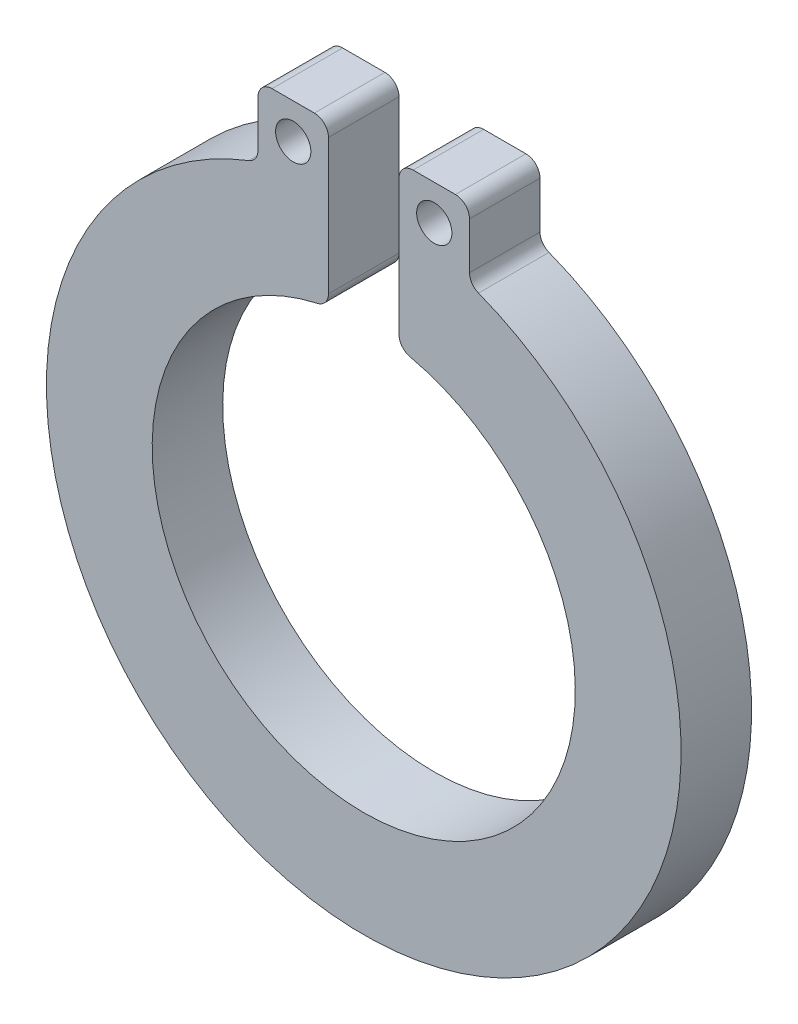
ISO-10303-21;
HEADER;
FILE_DESCRIPTION(('STEP AP214'),'2;1');
FILE_NAME('part.step','',(''),(''),'','','');
FILE_SCHEMA(('AUTOMOTIVE_DESIGN { 1 0 10303 214 1 1 1 1 }'));
ENDSEC;
DATA;
#1=APPLICATION_CONTEXT('core data for automotive mechanical design processes');
#2=APPLICATION_PROTOCOL_DEFINITION('international standard','automotive_design',2000,#1);
#3=PRODUCT_CONTEXT('',#1,'mechanical');
#4=PRODUCT('Part','Part','',(#3));
#5=PRODUCT_RELATED_PRODUCT_CATEGORY('part','',(#4));
#6=PRODUCT_DEFINITION_FORMATION('','',#4);
#7=PRODUCT_DEFINITION_CONTEXT('part definition',#1,'design');
#8=PRODUCT_DEFINITION('design','',#6,#7);
#9=PRODUCT_DEFINITION_SHAPE('','',#8);
#10=(LENGTH_UNIT() NAMED_UNIT(*) SI_UNIT(.MILLI.,.METRE.));
#11=(NAMED_UNIT(*) PLANE_ANGLE_UNIT() SI_UNIT($,.RADIAN.));
#12=(NAMED_UNIT(*) SI_UNIT($,.STERADIAN.) SOLID_ANGLE_UNIT());
#13=UNCERTAINTY_MEASURE_WITH_UNIT(LENGTH_MEASURE(1.E-05),#10,'distance_accuracy_value','');
#14=(GEOMETRIC_REPRESENTATION_CONTEXT(3) GLOBAL_UNCERTAINTY_ASSIGNED_CONTEXT((#13)) GLOBAL_UNIT_ASSIGNED_CONTEXT((#10,
#11,#12)) REPRESENTATION_CONTEXT('',''));
#15=CARTESIAN_POINT('',(0.,0.,0.));
#16=DIRECTION('',(0.,0.,1.));
#17=DIRECTION('',(1.,0.,0.));
#18=AXIS2_PLACEMENT_3D('',#15,#16,#17);
#19=CARTESIAN_POINT('',(0.,0.,0.5));
#20=DIRECTION('',(0.,0.,1.));
#21=DIRECTION('',(1.,0.,0.));
#22=AXIS2_PLACEMENT_3D('',#19,#20,#21);
#23=PLANE('',#22);
#24=CARTESIAN_POINT('',(-0.5,2.37132034355964,0.5));
#25=DIRECTION('',(0.,0.,1.));
#26=DIRECTION('',(1.,0.,0.));
#27=AXIS2_PLACEMENT_3D('',#24,#25,#26);
#28=CIRCLE('',#27,0.125);
#29=CARTESIAN_POINT('',(-0.375,2.37132034355964,0.5));
#30=VERTEX_POINT('',#29);
#31=EDGE_CURVE('E186',#30,#30,#28,.T.);
#32=ORIENTED_EDGE('',*,*,#31,.F.);
#33=EDGE_LOOP('',(#32));
#34=FACE_BOUND('',#33,.T.);
#35=DIRECTION('',(-1.,0.,0.));
#36=VECTOR('',#35,1.);
#37=CARTESIAN_POINT('',(-0.25,2.62132034355964,0.5));
#38=LINE('',#37,#36);
#39=CARTESIAN_POINT('',(-0.35,2.62132034355964,0.5));
#40=VERTEX_POINT('',#39);
#41=CARTESIAN_POINT('',(-0.65,2.62132034355964,0.5));
#42=VERTEX_POINT('',#41);
#43=EDGE_CURVE('E203',#40,#42,#38,.T.);
#44=ORIENTED_EDGE('',*,*,#43,.T.);
#45=CARTESIAN_POINT('',(-0.65,2.52132034355964,0.5));
#46=DIRECTION('',(0.,0.,1.));
#47=DIRECTION('',(1.,0.,0.));
#48=AXIS2_PLACEMENT_3D('',#45,#46,#47);
#49=CIRCLE('',#48,0.1);
#50=CARTESIAN_POINT('',(-0.75,2.52132034355964,0.5));
#51=VERTEX_POINT('',#50);
#52=EDGE_CURVE('E226',#42,#51,#49,.T.);
#53=ORIENTED_EDGE('',*,*,#52,.T.);
#54=DIRECTION('',(0.,-1.,0.));
#55=VECTOR('',#54,1.);
#56=CARTESIAN_POINT('',(-0.75,2.62132034355964,0.5));
#57=LINE('',#56,#55);
#58=CARTESIAN_POINT('',(-0.75,2.19089023002066,0.5));
#59=VERTEX_POINT('',#58);
#60=EDGE_CURVE('E173',#51,#59,#57,.T.);
#61=ORIENTED_EDGE('',*,*,#60,.T.);
#62=CARTESIAN_POINT('',(-0.85,2.19089023002066,0.5));
#63=DIRECTION('',(0.,0.,1.));
#64=DIRECTION('',(1.,0.,0.));
#65=AXIS2_PLACEMENT_3D('',#62,#63,#64);
#66=CIRCLE('',#65,0.1);
#67=CARTESIAN_POINT('',(-0.813829787234043,2.09766085853042,0.5));
#68=VERTEX_POINT('',#67);
#69=EDGE_CURVE('E11',#59,#68,#66,.F.);
#70=ORIENTED_EDGE('',*,*,#69,.T.);
#71=CARTESIAN_POINT('',(0.,0.,0.5));
#72=DIRECTION('',(0.,0.,1.));
#73=DIRECTION('',(1.,0.,0.));
#74=AXIS2_PLACEMENT_3D('',#71,#72,#73);
#75=CIRCLE('',#74,2.25);
#76=CARTESIAN_POINT('',(0.813829787234043,2.09766085853042,0.5));
#77=VERTEX_POINT('',#76);
#78=EDGE_CURVE('E269',#68,#77,#75,.T.);
#79=ORIENTED_EDGE('',*,*,#78,.T.);
#80=CARTESIAN_POINT('',(0.85,2.19089023002066,0.5));
#81=DIRECTION('',(0.,0.,1.));
#82=DIRECTION('',(1.,0.,0.));
#83=AXIS2_PLACEMENT_3D('',#80,#81,#82);
#84=CIRCLE('',#83,0.1);
#85=CARTESIAN_POINT('',(0.75,2.19089023002066,0.5));
#86=VERTEX_POINT('',#85);
#87=EDGE_CURVE('E259',#77,#86,#84,.F.);
#88=ORIENTED_EDGE('',*,*,#87,.T.);
#89=DIRECTION('',(0.,1.,0.));
#90=VECTOR('',#89,1.);
#91=CARTESIAN_POINT('',(0.75,2.62132034355964,0.5));
#92=LINE('',#91,#90);
#93=CARTESIAN_POINT('',(0.75,2.52132034355964,0.5));
#94=VERTEX_POINT('',#93);
#95=EDGE_CURVE('E266',#86,#94,#92,.T.);
#96=ORIENTED_EDGE('',*,*,#95,.T.);
#97=CARTESIAN_POINT('',(0.65,2.52132034355964,0.5));
#98=DIRECTION('',(0.,0.,1.));
#99=DIRECTION('',(1.,0.,0.));
#100=AXIS2_PLACEMENT_3D('',#97,#98,#99);
#101=CIRCLE('',#100,0.1);
#102=CARTESIAN_POINT('',(0.65,2.62132034355964,0.5));
#103=VERTEX_POINT('',#102);
#104=EDGE_CURVE('E220',#94,#103,#101,.T.);
#105=ORIENTED_EDGE('',*,*,#104,.T.);
#106=DIRECTION('',(-1.,0.,0.));
#107=VECTOR('',#106,1.);
#108=CARTESIAN_POINT('',(0.25,2.62132034355964,0.5));
#109=LINE('',#108,#107);
#110=CARTESIAN_POINT('',(0.35,2.62132034355964,0.5));
#111=VERTEX_POINT('',#110);
#112=EDGE_CURVE('E277',#103,#111,#109,.T.);
#113=ORIENTED_EDGE('',*,*,#112,.T.);
#114=CARTESIAN_POINT('',(0.35,2.52132034355964,0.5));
#115=DIRECTION('',(0.,0.,1.));
#116=DIRECTION('',(1.,0.,0.));
#117=AXIS2_PLACEMENT_3D('',#114,#115,#116);
#118=CIRCLE('',#117,0.1);
#119=CARTESIAN_POINT('',(0.25,2.52132034355964,0.5));
#120=VERTEX_POINT('',#119);
#121=EDGE_CURVE('E222',#111,#120,#118,.T.);
#122=ORIENTED_EDGE('',*,*,#121,.T.);
#123=DIRECTION('',(0.,-1.,0.));
#124=VECTOR('',#123,1.);
#125=CARTESIAN_POINT('',(0.25,2.62132034355964,0.5));
#126=LINE('',#125,#124);
#127=CARTESIAN_POINT('',(0.25,1.5612494995996,0.5));
#128=VERTEX_POINT('',#127);
#129=EDGE_CURVE('E293',#120,#128,#126,.T.);
#130=ORIENTED_EDGE('',*,*,#129,.T.);
#131=CARTESIAN_POINT('',(0.35,1.5612494995996,0.5));
#132=DIRECTION('',(0.,0.,1.));
#133=DIRECTION('',(1.,0.,0.));
#134=AXIS2_PLACEMENT_3D('',#131,#132,#133);
#135=CIRCLE('',#134,0.1);
#136=CARTESIAN_POINT('',(0.328125,1.46367140587462,0.5));
#137=VERTEX_POINT('',#136);
#138=EDGE_CURVE('E218',#128,#137,#135,.T.);
#139=ORIENTED_EDGE('',*,*,#138,.T.);
#140=CARTESIAN_POINT('',(0.,0.,0.5));
#141=DIRECTION('',(0.,0.,-1.));
#142=DIRECTION('',(1.,0.,0.));
#143=AXIS2_PLACEMENT_3D('',#140,#141,#142);
#144=CIRCLE('',#143,1.5);
#145=CARTESIAN_POINT('',(-0.328125,1.46367140587462,0.5));
#146=VERTEX_POINT('',#145);
#147=EDGE_CURVE('E296',#137,#146,#144,.T.);
#148=ORIENTED_EDGE('',*,*,#147,.T.);
#149=CARTESIAN_POINT('',(-0.35,1.5612494995996,0.5));
#150=DIRECTION('',(0.,0.,1.));
#151=DIRECTION('',(1.,0.,0.));
#152=AXIS2_PLACEMENT_3D('',#149,#150,#151);
#153=CIRCLE('',#152,0.1);
#154=CARTESIAN_POINT('',(-0.25,1.5612494995996,0.5));
#155=VERTEX_POINT('',#154);
#156=EDGE_CURVE('E61',#146,#155,#153,.T.);
#157=ORIENTED_EDGE('',*,*,#156,.T.);
#158=DIRECTION('',(0.,1.,0.));
#159=VECTOR('',#158,1.);
#160=CARTESIAN_POINT('',(-0.25,2.62132034355964,0.5));
#161=LINE('',#160,#159);
#162=CARTESIAN_POINT('',(-0.25,2.52132034355964,0.5));
#163=VERTEX_POINT('',#162);
#164=EDGE_CURVE('E204',#155,#163,#161,.T.);
#165=ORIENTED_EDGE('',*,*,#164,.T.);
#166=CARTESIAN_POINT('',(-0.35,2.52132034355964,0.5));
#167=DIRECTION('',(0.,0.,1.));
#168=DIRECTION('',(1.,0.,0.));
#169=AXIS2_PLACEMENT_3D('',#166,#167,#168);
#170=CIRCLE('',#169,0.1);
#171=EDGE_CURVE('E224',#163,#40,#170,.T.);
#172=ORIENTED_EDGE('',*,*,#171,.T.);
#173=EDGE_LOOP('',(#44,#53,#61,#70,#79,#88,#96,#105,#113,#122,#130,#139,#148,#157,#165,#172));
#174=FACE_BOUND('',#173,.T.);
#175=CARTESIAN_POINT('',(0.5,2.37132034355964,0.5));
#176=DIRECTION('',(0.,0.,1.));
#177=DIRECTION('',(1.,0.,0.));
#178=AXIS2_PLACEMENT_3D('',#175,#176,#177);
#179=CIRCLE('',#178,0.125);
#180=CARTESIAN_POINT('',(0.625,2.37132034355964,0.5));
#181=VERTEX_POINT('',#180);
#182=EDGE_CURVE('E503',#181,#181,#179,.T.);
#183=ORIENTED_EDGE('',*,*,#182,.F.);
#184=EDGE_LOOP('',(#183));
#185=FACE_BOUND('',#184,.T.);
#186=ADVANCED_FACE('F39',(#34,#174,#185),#23,.T.);
#187=CARTESIAN_POINT('',(0.,0.,0.));
#188=DIRECTION('',(0.,0.,1.));
#189=DIRECTION('',(1.,0.,0.));
#190=AXIS2_PLACEMENT_3D('',#187,#188,#189);
#191=PLANE('',#190);
#192=DIRECTION('',(0.,-1.,0.));
#193=VECTOR('',#192,1.);
#194=CARTESIAN_POINT('',(-0.75,2.62132034355964,0.));
#195=LINE('',#194,#193);
#196=CARTESIAN_POINT('',(-0.75,2.52132034355964,0.));
#197=VERTEX_POINT('',#196);
#198=CARTESIAN_POINT('',(-0.75,2.19089023002066,0.));
#199=VERTEX_POINT('',#198);
#200=EDGE_CURVE('E170',#197,#199,#195,.T.);
#201=ORIENTED_EDGE('',*,*,#200,.F.);
#202=CARTESIAN_POINT('',(-0.65,2.52132034355964,0.));
#203=DIRECTION('',(0.,0.,1.));
#204=DIRECTION('',(1.,0.,0.));
#205=AXIS2_PLACEMENT_3D('',#202,#203,#204);
#206=CIRCLE('',#205,0.1);
#207=CARTESIAN_POINT('',(-0.65,2.62132034355964,0.));
#208=VERTEX_POINT('',#207);
#209=EDGE_CURVE('E153',#197,#208,#206,.F.);
#210=ORIENTED_EDGE('',*,*,#209,.T.);
#211=DIRECTION('',(-1.,0.,0.));
#212=VECTOR('',#211,1.);
#213=CARTESIAN_POINT('',(-0.25,2.62132034355964,0.));
#214=LINE('',#213,#212);
#215=CARTESIAN_POINT('',(-0.35,2.62132034355964,0.));
#216=VERTEX_POINT('',#215);
#217=EDGE_CURVE('E181',#216,#208,#214,.T.);
#218=ORIENTED_EDGE('',*,*,#217,.F.);
#219=CARTESIAN_POINT('',(-0.35,2.52132034355964,0.));
#220=DIRECTION('',(0.,0.,1.));
#221=DIRECTION('',(1.,0.,0.));
#222=AXIS2_PLACEMENT_3D('',#219,#220,#221);
#223=CIRCLE('',#222,0.1);
#224=CARTESIAN_POINT('',(-0.25,2.52132034355964,0.));
#225=VERTEX_POINT('',#224);
#226=EDGE_CURVE('E164',#216,#225,#223,.F.);
#227=ORIENTED_EDGE('',*,*,#226,.T.);
#228=DIRECTION('',(0.,1.,0.));
#229=VECTOR('',#228,1.);
#230=CARTESIAN_POINT('',(-0.25,2.62132034355964,0.));
#231=LINE('',#230,#229);
#232=CARTESIAN_POINT('',(-0.25,1.5612494995996,0.));
#233=VERTEX_POINT('',#232);
#234=EDGE_CURVE('E201',#233,#225,#231,.T.);
#235=ORIENTED_EDGE('',*,*,#234,.F.);
#236=CARTESIAN_POINT('',(-0.35,1.5612494995996,0.));
#237=DIRECTION('',(0.,0.,1.));
#238=DIRECTION('',(1.,0.,0.));
#239=AXIS2_PLACEMENT_3D('',#236,#237,#238);
#240=CIRCLE('',#239,0.1);
#241=CARTESIAN_POINT('',(-0.328125,1.46367140587462,0.));
#242=VERTEX_POINT('',#241);
#243=EDGE_CURVE('E174',#233,#242,#240,.F.);
#244=ORIENTED_EDGE('',*,*,#243,.T.);
#245=CARTESIAN_POINT('',(0.,0.,0.));
#246=DIRECTION('',(0.,0.,-1.));
#247=DIRECTION('',(1.,0.,0.));
#248=AXIS2_PLACEMENT_3D('',#245,#246,#247);
#249=CIRCLE('',#248,1.5);
#250=CARTESIAN_POINT('',(0.328125,1.46367140587462,0.));
#251=VERTEX_POINT('',#250);
#252=EDGE_CURVE('E198',#251,#242,#249,.T.);
#253=ORIENTED_EDGE('',*,*,#252,.F.);
#254=CARTESIAN_POINT('',(0.35,1.5612494995996,0.));
#255=DIRECTION('',(0.,0.,1.));
#256=DIRECTION('',(1.,0.,0.));
#257=AXIS2_PLACEMENT_3D('',#254,#255,#256);
#258=CIRCLE('',#257,0.1);
#259=CARTESIAN_POINT('',(0.25,1.5612494995996,0.));
#260=VERTEX_POINT('',#259);
#261=EDGE_CURVE('E207',#251,#260,#258,.F.);
#262=ORIENTED_EDGE('',*,*,#261,.T.);
#263=DIRECTION('',(0.,-1.,0.));
#264=VECTOR('',#263,1.);
#265=CARTESIAN_POINT('',(0.25,2.62132034355964,0.));
#266=LINE('',#265,#264);
#267=CARTESIAN_POINT('',(0.25,2.52132034355964,0.));
#268=VERTEX_POINT('',#267);
#269=EDGE_CURVE('E195',#268,#260,#266,.T.);
#270=ORIENTED_EDGE('',*,*,#269,.F.);
#271=CARTESIAN_POINT('',(0.35,2.52132034355964,0.));
#272=DIRECTION('',(0.,0.,1.));
#273=DIRECTION('',(1.,0.,0.));
#274=AXIS2_PLACEMENT_3D('',#271,#272,#273);
#275=CIRCLE('',#274,0.1);
#276=CARTESIAN_POINT('',(0.35,2.62132034355964,0.));
#277=VERTEX_POINT('',#276);
#278=EDGE_CURVE('E211',#268,#277,#275,.F.);
#279=ORIENTED_EDGE('',*,*,#278,.T.);
#280=DIRECTION('',(-1.,0.,0.));
#281=VECTOR('',#280,1.);
#282=CARTESIAN_POINT('',(0.25,2.62132034355964,0.));
#283=LINE('',#282,#281);
#284=CARTESIAN_POINT('',(0.65,2.62132034355964,0.));
#285=VERTEX_POINT('',#284);
#286=EDGE_CURVE('E192',#285,#277,#283,.T.);
#287=ORIENTED_EDGE('',*,*,#286,.F.);
#288=CARTESIAN_POINT('',(0.65,2.52132034355964,0.));
#289=DIRECTION('',(0.,0.,1.));
#290=DIRECTION('',(1.,0.,0.));
#291=AXIS2_PLACEMENT_3D('',#288,#289,#290);
#292=CIRCLE('',#291,0.1);
#293=CARTESIAN_POINT('',(0.75,2.52132034355964,0.));
#294=VERTEX_POINT('',#293);
#295=EDGE_CURVE('E209',#285,#294,#292,.F.);
#296=ORIENTED_EDGE('',*,*,#295,.T.);
#297=DIRECTION('',(0.,1.,0.));
#298=VECTOR('',#297,1.);
#299=CARTESIAN_POINT('',(0.75,2.62132034355964,0.));
#300=LINE('',#299,#298);
#301=CARTESIAN_POINT('',(0.75,2.19089023002066,0.));
#302=VERTEX_POINT('',#301);
#303=EDGE_CURVE('E184',#302,#294,#300,.T.);
#304=ORIENTED_EDGE('',*,*,#303,.F.);
#305=CARTESIAN_POINT('',(0.85,2.19089023002066,0.));
#306=DIRECTION('',(0.,0.,1.));
#307=DIRECTION('',(1.,0.,0.));
#308=AXIS2_PLACEMENT_3D('',#305,#306,#307);
#309=CIRCLE('',#308,0.1);
#310=CARTESIAN_POINT('',(0.813829787234043,2.09766085853042,0.));
#311=VERTEX_POINT('',#310);
#312=EDGE_CURVE('E257',#302,#311,#309,.T.);
#313=ORIENTED_EDGE('',*,*,#312,.T.);
#314=CARTESIAN_POINT('',(0.,0.,0.));
#315=DIRECTION('',(0.,0.,1.));
#316=DIRECTION('',(1.,0.,0.));
#317=AXIS2_PLACEMENT_3D('',#314,#315,#316);
#318=CIRCLE('',#317,2.25);
#319=CARTESIAN_POINT('',(-0.813829787234043,2.09766085853042,0.));
#320=VERTEX_POINT('',#319);
#321=EDGE_CURVE('E180',#320,#311,#318,.T.);
#322=ORIENTED_EDGE('',*,*,#321,.F.);
#323=CARTESIAN_POINT('',(-0.85,2.19089023002066,0.));
#324=DIRECTION('',(0.,0.,1.));
#325=DIRECTION('',(1.,0.,0.));
#326=AXIS2_PLACEMENT_3D('',#323,#324,#325);
#327=CIRCLE('',#326,0.1);
#328=EDGE_CURVE('E47',#320,#199,#327,.T.);
#329=ORIENTED_EDGE('',*,*,#328,.T.);
#330=EDGE_LOOP('',(#201,#210,#218,#227,#235,#244,#253,#262,#270,#279,#287,#296,#304,#313,#322,#329));
#331=FACE_BOUND('',#330,.T.);
#332=CARTESIAN_POINT('',(-0.5,2.37132034355964,0.));
#333=DIRECTION('',(0.,0.,1.));
#334=DIRECTION('',(1.,0.,0.));
#335=AXIS2_PLACEMENT_3D('',#332,#333,#334);
#336=CIRCLE('',#335,0.125);
#337=CARTESIAN_POINT('',(-0.375,2.37132034355964,0.));
#338=VERTEX_POINT('',#337);
#339=EDGE_CURVE('E502',#338,#338,#336,.T.);
#340=ORIENTED_EDGE('',*,*,#339,.T.);
#341=EDGE_LOOP('',(#340));
#342=FACE_BOUND('',#341,.T.);
#343=CARTESIAN_POINT('',(0.5,2.37132034355964,0.));
#344=DIRECTION('',(0.,0.,1.));
#345=DIRECTION('',(1.,0.,0.));
#346=AXIS2_PLACEMENT_3D('',#343,#344,#345);
#347=CIRCLE('',#346,0.125);
#348=CARTESIAN_POINT('',(0.625,2.37132034355964,0.));
#349=VERTEX_POINT('',#348);
#350=EDGE_CURVE('E506',#349,#349,#347,.T.);
#351=ORIENTED_EDGE('',*,*,#350,.T.);
#352=EDGE_LOOP('',(#351));
#353=FACE_BOUND('',#352,.T.);
#354=ADVANCED_FACE('F177',(#331,#342,#353),#191,.F.);
#355=CARTESIAN_POINT('',(-0.25,2.62132034355964,0.5));
#356=DIRECTION('',(0.,-1.,0.));
#357=DIRECTION('',(0.,0.,-1.));
#358=AXIS2_PLACEMENT_3D('',#355,#356,#357);
#359=PLANE('',#358);
#360=ORIENTED_EDGE('',*,*,#217,.T.);
#361=DIRECTION('',(0.,0.,-1.));
#362=VECTOR('',#361,1.);
#363=CARTESIAN_POINT('',(-0.65,2.62132034355964,0.5));
#364=LINE('',#363,#362);
#365=EDGE_CURVE('E158',#208,#42,#364,.F.);
#366=ORIENTED_EDGE('',*,*,#365,.T.);
#367=ORIENTED_EDGE('',*,*,#43,.F.);
#368=DIRECTION('',(0.,0.,-1.));
#369=VECTOR('',#368,1.);
#370=CARTESIAN_POINT('',(-0.35,2.62132034355964,0.5));
#371=LINE('',#370,#369);
#372=EDGE_CURVE('E163',#40,#216,#371,.T.);
#373=ORIENTED_EDGE('',*,*,#372,.T.);
#374=EDGE_LOOP('',(#360,#366,#367,#373));
#375=FACE_BOUND('',#374,.T.);
#376=ADVANCED_FACE('F304',(#375),#359,.F.);
#377=CARTESIAN_POINT('',(-0.75,2.62132034355964,0.5));
#378=DIRECTION('',(1.,0.,0.));
#379=DIRECTION('',(0.,1.,0.));
#380=AXIS2_PLACEMENT_3D('',#377,#378,#379);
#381=PLANE('',#380);
#382=ORIENTED_EDGE('',*,*,#60,.F.);
#383=DIRECTION('',(0.,0.,-1.));
#384=VECTOR('',#383,1.);
#385=CARTESIAN_POINT('',(-0.75,2.52132034355964,0.5));
#386=LINE('',#385,#384);
#387=EDGE_CURVE('E157',#51,#197,#386,.T.);
#388=ORIENTED_EDGE('',*,*,#387,.T.);
#389=ORIENTED_EDGE('',*,*,#200,.T.);
#390=DIRECTION('',(0.,0.,1.));
#391=VECTOR('',#390,1.);
#392=CARTESIAN_POINT('',(-0.75,2.19089023002066,0.5));
#393=LINE('',#392,#391);
#394=EDGE_CURVE('E175',#199,#59,#393,.T.);
#395=ORIENTED_EDGE('',*,*,#394,.T.);
#396=EDGE_LOOP('',(#382,#388,#389,#395));
#397=FACE_BOUND('',#396,.T.);
#398=ADVANCED_FACE('F169',(#397),#381,.F.);
#399=CARTESIAN_POINT('',(0.,0.,0.5));
#400=DIRECTION('',(0.,0.,-1.));
#401=DIRECTION('',(-1.,0.,0.));
#402=AXIS2_PLACEMENT_3D('',#399,#400,#401);
#403=CYLINDRICAL_SURFACE('',#402,2.25);
#404=ORIENTED_EDGE('',*,*,#321,.T.);
#405=DIRECTION('',(0.,0.,-1.));
#406=VECTOR('',#405,1.);
#407=CARTESIAN_POINT('',(0.813829787234043,2.09766085853042,0.5));
#408=LINE('',#407,#406);
#409=EDGE_CURVE('E250',#311,#77,#408,.F.);
#410=ORIENTED_EDGE('',*,*,#409,.T.);
#411=ORIENTED_EDGE('',*,*,#78,.F.);
#412=DIRECTION('',(0.,0.,-1.));
#413=VECTOR('',#412,1.);
#414=CARTESIAN_POINT('',(-0.813829787234043,2.09766085853042,0.5));
#415=LINE('',#414,#413);
#416=EDGE_CURVE('E247',#68,#320,#415,.T.);
#417=ORIENTED_EDGE('',*,*,#416,.T.);
#418=EDGE_LOOP('',(#404,#410,#411,#417));
#419=FACE_BOUND('',#418,.T.);
#420=ADVANCED_FACE('F281',(#419),#403,.T.);
#421=CARTESIAN_POINT('',(0.75,2.62132034355964,0.5));
#422=DIRECTION('',(-1.,0.,0.));
#423=DIRECTION('',(0.,-1.,0.));
#424=AXIS2_PLACEMENT_3D('',#421,#422,#423);
#425=PLANE('',#424);
#426=ORIENTED_EDGE('',*,*,#303,.T.);
#427=DIRECTION('',(0.,0.,-1.));
#428=VECTOR('',#427,1.);
#429=CARTESIAN_POINT('',(0.75,2.52132034355964,0.5));
#430=LINE('',#429,#428);
#431=EDGE_CURVE('E245',#294,#94,#430,.F.);
#432=ORIENTED_EDGE('',*,*,#431,.T.);
#433=ORIENTED_EDGE('',*,*,#95,.F.);
#434=DIRECTION('',(0.,0.,1.));
#435=VECTOR('',#434,1.);
#436=CARTESIAN_POINT('',(0.75,2.19089023002066,0.));
#437=LINE('',#436,#435);
#438=EDGE_CURVE('E242',#86,#302,#437,.F.);
#439=ORIENTED_EDGE('',*,*,#438,.T.);
#440=EDGE_LOOP('',(#426,#432,#433,#439));
#441=FACE_BOUND('',#440,.T.);
#442=ADVANCED_FACE('F274',(#441),#425,.F.);
#443=CARTESIAN_POINT('',(0.25,2.62132034355964,0.5));
#444=DIRECTION('',(0.,-1.,0.));
#445=DIRECTION('',(0.,0.,-1.));
#446=AXIS2_PLACEMENT_3D('',#443,#444,#445);
#447=PLANE('',#446);
#448=ORIENTED_EDGE('',*,*,#286,.T.);
#449=DIRECTION('',(0.,0.,-1.));
#450=VECTOR('',#449,1.);
#451=CARTESIAN_POINT('',(0.35,2.62132034355964,0.5));
#452=LINE('',#451,#450);
#453=EDGE_CURVE('E240',#277,#111,#452,.F.);
#454=ORIENTED_EDGE('',*,*,#453,.T.);
#455=ORIENTED_EDGE('',*,*,#112,.F.);
#456=DIRECTION('',(0.,0.,-1.));
#457=VECTOR('',#456,1.);
#458=CARTESIAN_POINT('',(0.65,2.62132034355964,0.5));
#459=LINE('',#458,#457);
#460=EDGE_CURVE('E237',#103,#285,#459,.T.);
#461=ORIENTED_EDGE('',*,*,#460,.T.);
#462=EDGE_LOOP('',(#448,#454,#455,#461));
#463=FACE_BOUND('',#462,.T.);
#464=ADVANCED_FACE('F329',(#463),#447,.F.);
#465=CARTESIAN_POINT('',(0.25,2.62132034355964,0.5));
#466=DIRECTION('',(1.,0.,0.));
#467=DIRECTION('',(0.,1.,0.));
#468=AXIS2_PLACEMENT_3D('',#465,#466,#467);
#469=PLANE('',#468);
#470=ORIENTED_EDGE('',*,*,#129,.F.);
#471=DIRECTION('',(0.,0.,-1.));
#472=VECTOR('',#471,1.);
#473=CARTESIAN_POINT('',(0.25,2.52132034355964,0.5));
#474=LINE('',#473,#472);
#475=EDGE_CURVE('E234',#120,#268,#474,.T.);
#476=ORIENTED_EDGE('',*,*,#475,.T.);
#477=ORIENTED_EDGE('',*,*,#269,.T.);
#478=DIRECTION('',(0.,0.,-1.));
#479=VECTOR('',#478,1.);
#480=CARTESIAN_POINT('',(0.25,1.5612494995996,0.5));
#481=LINE('',#480,#479);
#482=EDGE_CURVE('E232',#260,#128,#481,.F.);
#483=ORIENTED_EDGE('',*,*,#482,.T.);
#484=EDGE_LOOP('',(#470,#476,#477,#483));
#485=FACE_BOUND('',#484,.T.);
#486=ADVANCED_FACE('F321',(#485),#469,.F.);
#487=CARTESIAN_POINT('',(0.,0.,0.5));
#488=DIRECTION('',(0.,0.,-1.));
#489=DIRECTION('',(-1.,0.,0.));
#490=AXIS2_PLACEMENT_3D('',#487,#488,#489);
#491=CYLINDRICAL_SURFACE('',#490,1.5);
#492=ORIENTED_EDGE('',*,*,#147,.F.);
#493=DIRECTION('',(0.,0.,-1.));
#494=VECTOR('',#493,1.);
#495=CARTESIAN_POINT('',(0.328125,1.46367140587462,0.5));
#496=LINE('',#495,#494);
#497=EDGE_CURVE('E254',#137,#251,#496,.T.);
#498=ORIENTED_EDGE('',*,*,#497,.T.);
#499=ORIENTED_EDGE('',*,*,#252,.T.);
#500=DIRECTION('',(0.,0.,-1.));
#501=VECTOR('',#500,1.);
#502=CARTESIAN_POINT('',(-0.328125,1.46367140587462,0.5));
#503=LINE('',#502,#501);
#504=EDGE_CURVE('E252',#242,#146,#503,.F.);
#505=ORIENTED_EDGE('',*,*,#504,.T.);
#506=EDGE_LOOP('',(#492,#498,#499,#505));
#507=FACE_BOUND('',#506,.T.);
#508=ADVANCED_FACE('F312',(#507),#491,.F.);
#509=CARTESIAN_POINT('',(-0.25,2.62132034355964,0.5));
#510=DIRECTION('',(-1.,0.,0.));
#511=DIRECTION('',(0.,-1.,0.));
#512=AXIS2_PLACEMENT_3D('',#509,#510,#511);
#513=PLANE('',#512);
#514=ORIENTED_EDGE('',*,*,#234,.T.);
#515=DIRECTION('',(0.,0.,-1.));
#516=VECTOR('',#515,1.);
#517=CARTESIAN_POINT('',(-0.25,2.52132034355964,0.5));
#518=LINE('',#517,#516);
#519=EDGE_CURVE('E54',#225,#163,#518,.F.);
#520=ORIENTED_EDGE('',*,*,#519,.T.);
#521=ORIENTED_EDGE('',*,*,#164,.F.);
#522=DIRECTION('',(0.,0.,-1.));
#523=VECTOR('',#522,1.);
#524=CARTESIAN_POINT('',(-0.25,1.5612494995996,0.5));
#525=LINE('',#524,#523);
#526=EDGE_CURVE('E228',#155,#233,#525,.T.);
#527=ORIENTED_EDGE('',*,*,#526,.T.);
#528=EDGE_LOOP('',(#514,#520,#521,#527));
#529=FACE_BOUND('',#528,.T.);
#530=ADVANCED_FACE('F306',(#529),#513,.F.);
#531=CARTESIAN_POINT('',(-0.5,2.37132034355964,0.5));
#532=DIRECTION('',(0.,0.,-1.));
#533=DIRECTION('',(-1.,0.,0.));
#534=AXIS2_PLACEMENT_3D('',#531,#532,#533);
#535=CYLINDRICAL_SURFACE('',#534,0.125);
#536=ORIENTED_EDGE('',*,*,#31,.T.);
#537=EDGE_LOOP('',(#536));
#538=FACE_BOUND('',#537,.T.);
#539=ORIENTED_EDGE('',*,*,#339,.F.);
#540=EDGE_LOOP('',(#539));
#541=FACE_BOUND('',#540,.T.);
#542=ADVANCED_FACE('F352',(#538,#541),#535,.F.);
#543=CARTESIAN_POINT('',(0.5,2.37132034355964,0.5));
#544=DIRECTION('',(0.,0.,-1.));
#545=DIRECTION('',(-1.,0.,0.));
#546=AXIS2_PLACEMENT_3D('',#543,#544,#545);
#547=CYLINDRICAL_SURFACE('',#546,0.125);
#548=ORIENTED_EDGE('',*,*,#182,.T.);
#549=EDGE_LOOP('',(#548));
#550=FACE_BOUND('',#549,.T.);
#551=ORIENTED_EDGE('',*,*,#350,.F.);
#552=EDGE_LOOP('',(#551));
#553=FACE_BOUND('',#552,.T.);
#554=ADVANCED_FACE('F373',(#550,#553),#547,.F.);
#555=CARTESIAN_POINT('',(-0.65,2.52132034355964,0.5));
#556=DIRECTION('',(0.,0.,-1.));
#557=DIRECTION('',(-1.,0.,0.));
#558=AXIS2_PLACEMENT_3D('',#555,#556,#557);
#559=CYLINDRICAL_SURFACE('',#558,0.1);
#560=ORIENTED_EDGE('',*,*,#52,.F.);
#561=ORIENTED_EDGE('',*,*,#365,.F.);
#562=ORIENTED_EDGE('',*,*,#209,.F.);
#563=ORIENTED_EDGE('',*,*,#387,.F.);
#564=EDGE_LOOP('',(#560,#561,#562,#563));
#565=FACE_BOUND('',#564,.T.);
#566=ADVANCED_FACE('F156',(#565),#559,.T.);
#567=CARTESIAN_POINT('',(-0.35,2.52132034355964,0.5));
#568=DIRECTION('',(0.,0.,-1.));
#569=DIRECTION('',(-1.,0.,0.));
#570=AXIS2_PLACEMENT_3D('',#567,#568,#569);
#571=CYLINDRICAL_SURFACE('',#570,0.1);
#572=ORIENTED_EDGE('',*,*,#171,.F.);
#573=ORIENTED_EDGE('',*,*,#519,.F.);
#574=ORIENTED_EDGE('',*,*,#226,.F.);
#575=ORIENTED_EDGE('',*,*,#372,.F.);
#576=EDGE_LOOP('',(#572,#573,#574,#575));
#577=FACE_BOUND('',#576,.T.);
#578=ADVANCED_FACE('F302',(#577),#571,.T.);
#579=CARTESIAN_POINT('',(0.35,2.52132034355964,0.5));
#580=DIRECTION('',(0.,0.,-1.));
#581=DIRECTION('',(-1.,0.,0.));
#582=AXIS2_PLACEMENT_3D('',#579,#580,#581);
#583=CYLINDRICAL_SURFACE('',#582,0.1);
#584=ORIENTED_EDGE('',*,*,#121,.F.);
#585=ORIENTED_EDGE('',*,*,#453,.F.);
#586=ORIENTED_EDGE('',*,*,#278,.F.);
#587=ORIENTED_EDGE('',*,*,#475,.F.);
#588=EDGE_LOOP('',(#584,#585,#586,#587));
#589=FACE_BOUND('',#588,.T.);
#590=ADVANCED_FACE('F325',(#589),#583,.T.);
#591=CARTESIAN_POINT('',(0.65,2.52132034355964,0.5));
#592=DIRECTION('',(0.,0.,-1.));
#593=DIRECTION('',(-1.,0.,0.));
#594=AXIS2_PLACEMENT_3D('',#591,#592,#593);
#595=CYLINDRICAL_SURFACE('',#594,0.1);
#596=ORIENTED_EDGE('',*,*,#104,.F.);
#597=ORIENTED_EDGE('',*,*,#431,.F.);
#598=ORIENTED_EDGE('',*,*,#295,.F.);
#599=ORIENTED_EDGE('',*,*,#460,.F.);
#600=EDGE_LOOP('',(#596,#597,#598,#599));
#601=FACE_BOUND('',#600,.T.);
#602=ADVANCED_FACE('F333',(#601),#595,.T.);
#603=CARTESIAN_POINT('',(0.85,2.19089023002066,0.5));
#604=DIRECTION('',(0.,0.,-1.));
#605=DIRECTION('',(-1.,0.,0.));
#606=AXIS2_PLACEMENT_3D('',#603,#604,#605);
#607=CYLINDRICAL_SURFACE('',#606,0.1);
#608=ORIENTED_EDGE('',*,*,#87,.F.);
#609=ORIENTED_EDGE('',*,*,#409,.F.);
#610=ORIENTED_EDGE('',*,*,#312,.F.);
#611=ORIENTED_EDGE('',*,*,#438,.F.);
#612=EDGE_LOOP('',(#608,#609,#610,#611));
#613=FACE_BOUND('',#612,.T.);
#614=ADVANCED_FACE('F279',(#613),#607,.F.);
#615=CARTESIAN_POINT('',(-0.85,2.19089023002066,0.5));
#616=DIRECTION('',(0.,0.,-1.));
#617=DIRECTION('',(-1.,0.,0.));
#618=AXIS2_PLACEMENT_3D('',#615,#616,#617);
#619=CYLINDRICAL_SURFACE('',#618,0.1);
#620=ORIENTED_EDGE('',*,*,#69,.F.);
#621=ORIENTED_EDGE('',*,*,#394,.F.);
#622=ORIENTED_EDGE('',*,*,#328,.F.);
#623=ORIENTED_EDGE('',*,*,#416,.F.);
#624=EDGE_LOOP('',(#620,#621,#622,#623));
#625=FACE_BOUND('',#624,.T.);
#626=ADVANCED_FACE('F285',(#625),#619,.F.);
#627=CARTESIAN_POINT('',(0.35,1.5612494995996,0.5));
#628=DIRECTION('',(0.,0.,-1.));
#629=DIRECTION('',(-1.,0.,0.));
#630=AXIS2_PLACEMENT_3D('',#627,#628,#629);
#631=CYLINDRICAL_SURFACE('',#630,0.1);
#632=ORIENTED_EDGE('',*,*,#138,.F.);
#633=ORIENTED_EDGE('',*,*,#482,.F.);
#634=ORIENTED_EDGE('',*,*,#261,.F.);
#635=ORIENTED_EDGE('',*,*,#497,.F.);
#636=EDGE_LOOP('',(#632,#633,#634,#635));
#637=FACE_BOUND('',#636,.T.);
#638=ADVANCED_FACE('F316',(#637),#631,.T.);
#639=CARTESIAN_POINT('',(-0.35,1.5612494995996,0.5));
#640=DIRECTION('',(0.,0.,-1.));
#641=DIRECTION('',(-1.,0.,0.));
#642=AXIS2_PLACEMENT_3D('',#639,#640,#641);
#643=CYLINDRICAL_SURFACE('',#642,0.1);
#644=ORIENTED_EDGE('',*,*,#156,.F.);
#645=ORIENTED_EDGE('',*,*,#504,.F.);
#646=ORIENTED_EDGE('',*,*,#243,.F.);
#647=ORIENTED_EDGE('',*,*,#526,.F.);
#648=EDGE_LOOP('',(#644,#645,#646,#647));
#649=FACE_BOUND('',#648,.T.);
#650=ADVANCED_FACE('F41',(#649),#643,.T.);
#651=CLOSED_SHELL('',(#186,#354,#376,#398,#420,#442,#464,#486,#508,#530,#542,#554,#566,#578,
#590,#602,#614,#626,#638,#650));
#652=MANIFOLD_SOLID_BREP('B2',#651);
#653=ADVANCED_BREP_SHAPE_REPRESENTATION('',(#18,#652),#14);
#654=SHAPE_DEFINITION_REPRESENTATION(#9,#653);
ENDSEC;
END-ISO-10303-21;
